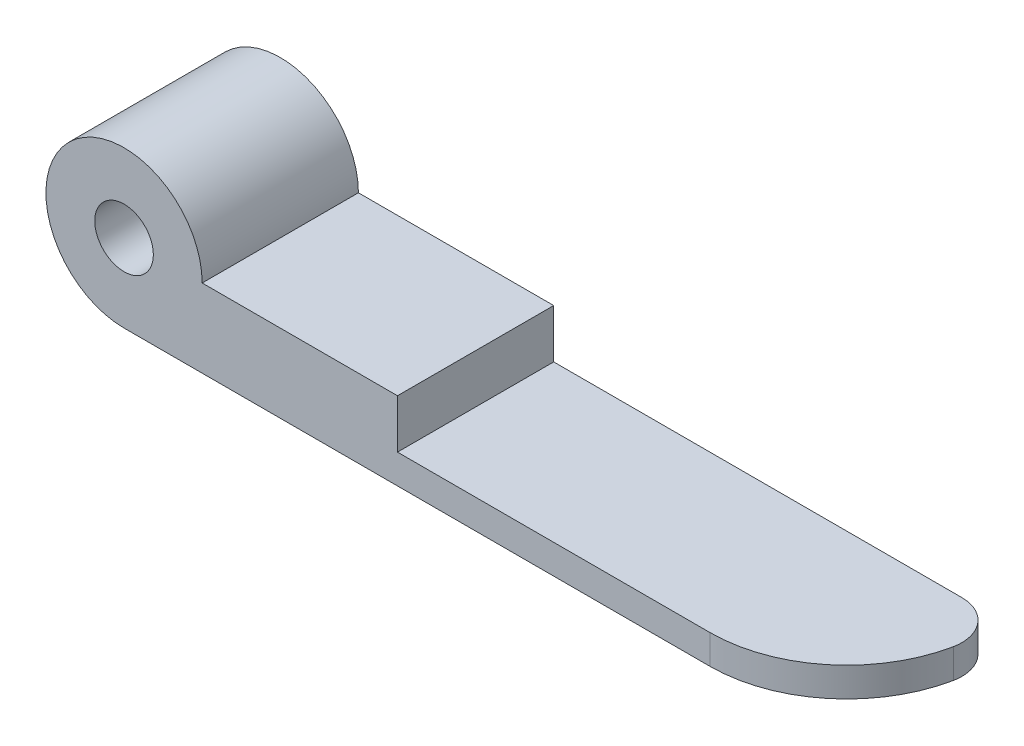
ISO-10303-21;
HEADER;
FILE_DESCRIPTION(('STEP AP214'),'2;1');
FILE_NAME('part.step','',(''),(''),'','','');
FILE_SCHEMA(('AUTOMOTIVE_DESIGN { 1 0 10303 214 1 1 1 1 }'));
ENDSEC;
DATA;
#1=APPLICATION_CONTEXT('core data for automotive mechanical design processes');
#2=APPLICATION_PROTOCOL_DEFINITION('international standard','automotive_design',2000,#1);
#3=PRODUCT_CONTEXT('',#1,'mechanical');
#4=PRODUCT('Part','Part','',(#3));
#5=PRODUCT_RELATED_PRODUCT_CATEGORY('part','',(#4));
#6=PRODUCT_DEFINITION_FORMATION('','',#4);
#7=PRODUCT_DEFINITION_CONTEXT('part definition',#1,'design');
#8=PRODUCT_DEFINITION('design','',#6,#7);
#9=PRODUCT_DEFINITION_SHAPE('','',#8);
#10=(LENGTH_UNIT() NAMED_UNIT(*) SI_UNIT(.MILLI.,.METRE.));
#11=(NAMED_UNIT(*) PLANE_ANGLE_UNIT() SI_UNIT($,.RADIAN.));
#12=(NAMED_UNIT(*) SI_UNIT($,.STERADIAN.) SOLID_ANGLE_UNIT());
#13=UNCERTAINTY_MEASURE_WITH_UNIT(LENGTH_MEASURE(1.E-05),#10,'distance_accuracy_value','');
#14=(GEOMETRIC_REPRESENTATION_CONTEXT(3) GLOBAL_UNCERTAINTY_ASSIGNED_CONTEXT((#13)) GLOBAL_UNIT_ASSIGNED_CONTEXT((#10,
#11,#12)) REPRESENTATION_CONTEXT('',''));
#15=CARTESIAN_POINT('',(0.,0.,0.));
#16=DIRECTION('',(0.,0.,1.));
#17=DIRECTION('',(1.,0.,0.));
#18=AXIS2_PLACEMENT_3D('',#15,#16,#17);
#19=CARTESIAN_POINT('',(0.,0.,8.));
#20=DIRECTION('',(0.,0.,-1.));
#21=DIRECTION('',(-1.,0.,0.));
#22=AXIS2_PLACEMENT_3D('',#19,#20,#21);
#23=CYLINDRICAL_SURFACE('',#22,4.);
#24=CARTESIAN_POINT('',(0.,0.,0.));
#25=DIRECTION('',(0.,0.,1.));
#26=DIRECTION('',(1.,0.,0.));
#27=AXIS2_PLACEMENT_3D('',#24,#25,#26);
#28=CIRCLE('',#27,4.);
#29=CARTESIAN_POINT('',(4.,0.,0.));
#30=VERTEX_POINT('',#29);
#31=CARTESIAN_POINT('',(0.,-4.,0.));
#32=VERTEX_POINT('',#31);
#33=EDGE_CURVE('E129',#30,#32,#28,.T.);
#34=ORIENTED_EDGE('',*,*,#33,.T.);
#35=DIRECTION('',(0.,0.,-1.));
#36=VECTOR('',#35,1.);
#37=CARTESIAN_POINT('',(0.,-4.,8.));
#38=LINE('',#37,#36);
#39=CARTESIAN_POINT('',(0.,-4.,8.));
#40=VERTEX_POINT('',#39);
#41=EDGE_CURVE('E137',#40,#32,#38,.T.);
#42=ORIENTED_EDGE('',*,*,#41,.F.);
#43=CARTESIAN_POINT('',(0.,0.,8.));
#44=DIRECTION('',(0.,0.,1.));
#45=DIRECTION('',(1.,0.,0.));
#46=AXIS2_PLACEMENT_3D('',#43,#44,#45);
#47=CIRCLE('',#46,4.);
#48=CARTESIAN_POINT('',(4.,0.,8.));
#49=VERTEX_POINT('',#48);
#50=EDGE_CURVE('E118',#49,#40,#47,.T.);
#51=ORIENTED_EDGE('',*,*,#50,.F.);
#52=DIRECTION('',(0.,0.,-1.));
#53=VECTOR('',#52,1.);
#54=CARTESIAN_POINT('',(4.,0.,8.));
#55=LINE('',#54,#53);
#56=EDGE_CURVE('E126',#49,#30,#55,.T.);
#57=ORIENTED_EDGE('',*,*,#56,.T.);
#58=EDGE_LOOP('',(#34,#42,#51,#57));
#59=FACE_BOUND('',#58,.T.);
#60=ADVANCED_FACE('F35',(#59),#23,.T.);
#61=CARTESIAN_POINT('',(0.,-4.,8.));
#62=DIRECTION('',(0.,1.,0.));
#63=DIRECTION('',(0.,0.,1.));
#64=AXIS2_PLACEMENT_3D('',#61,#62,#63);
#65=PLANE('',#64);
#66=DIRECTION('',(1.,0.,0.));
#67=VECTOR('',#66,1.);
#68=CARTESIAN_POINT('',(0.,-4.,0.));
#69=LINE('',#68,#67);
#70=CARTESIAN_POINT('',(34.8989794855664,-4.,0.));
#71=VERTEX_POINT('',#70);
#72=EDGE_CURVE('E132',#32,#71,#69,.T.);
#73=ORIENTED_EDGE('',*,*,#72,.T.);
#74=CARTESIAN_POINT('',(34.8989794855664,-4.,2.));
#75=DIRECTION('',(0.,1.,0.));
#76=DIRECTION('',(0.,0.,1.));
#77=AXIS2_PLACEMENT_3D('',#74,#75,#76);
#78=CIRCLE('',#77,2.);
#79=CARTESIAN_POINT('',(36.8585712797929,-4.,2.4));
#80=VERTEX_POINT('',#79);
#81=EDGE_CURVE('E11',#71,#80,#78,.F.);
#82=ORIENTED_EDGE('',*,*,#81,.T.);
#83=CARTESIAN_POINT('',(30.,-4.,1.));
#84=DIRECTION('',(0.,1.,0.));
#85=DIRECTION('',(0.,0.,1.));
#86=AXIS2_PLACEMENT_3D('',#83,#84,#85);
#87=CIRCLE('',#86,7.);
#88=CARTESIAN_POINT('',(30.,-4.,8.));
#89=VERTEX_POINT('',#88);
#90=EDGE_CURVE('E145',#80,#89,#87,.F.);
#91=ORIENTED_EDGE('',*,*,#90,.T.);
#92=DIRECTION('',(1.,0.,0.));
#93=VECTOR('',#92,1.);
#94=CARTESIAN_POINT('',(0.,-4.,8.));
#95=LINE('',#94,#93);
#96=EDGE_CURVE('E121',#40,#89,#95,.T.);
#97=ORIENTED_EDGE('',*,*,#96,.F.);
#98=ORIENTED_EDGE('',*,*,#41,.T.);
#99=EDGE_LOOP('',(#73,#82,#91,#97,#98));
#100=FACE_BOUND('',#99,.T.);
#101=ADVANCED_FACE('F170',(#100),#65,.F.);
#102=CARTESIAN_POINT('',(0.,0.,8.));
#103=DIRECTION('',(0.,0.,-1.));
#104=DIRECTION('',(-1.,0.,0.));
#105=AXIS2_PLACEMENT_3D('',#102,#103,#104);
#106=CYLINDRICAL_SURFACE('',#105,1.5);
#107=CARTESIAN_POINT('',(0.,0.,8.));
#108=DIRECTION('',(0.,0.,1.));
#109=DIRECTION('',(1.,0.,0.));
#110=AXIS2_PLACEMENT_3D('',#107,#108,#109);
#111=CIRCLE('',#110,1.5);
#112=CARTESIAN_POINT('',(1.5,0.,8.));
#113=VERTEX_POINT('',#112);
#114=EDGE_CURVE('E115',#113,#113,#111,.T.);
#115=ORIENTED_EDGE('',*,*,#114,.T.);
#116=EDGE_LOOP('',(#115));
#117=FACE_BOUND('',#116,.T.);
#118=CARTESIAN_POINT('',(0.,0.,0.));
#119=DIRECTION('',(0.,0.,1.));
#120=DIRECTION('',(1.,0.,0.));
#121=AXIS2_PLACEMENT_3D('',#118,#119,#120);
#122=CIRCLE('',#121,1.5);
#123=CARTESIAN_POINT('',(1.5,0.,0.));
#124=VERTEX_POINT('',#123);
#125=EDGE_CURVE('E111',#124,#124,#122,.T.);
#126=ORIENTED_EDGE('',*,*,#125,.F.);
#127=EDGE_LOOP('',(#126));
#128=FACE_BOUND('',#127,.T.);
#129=ADVANCED_FACE('F180',(#117,#128),#106,.F.);
#130=CARTESIAN_POINT('',(0.,0.,8.));
#131=DIRECTION('',(0.,-1.,0.));
#132=DIRECTION('',(1.,0.,0.));
#133=AXIS2_PLACEMENT_3D('',#130,#131,#132);
#134=PLANE('',#133);
#135=DIRECTION('',(-1.,0.,0.));
#136=VECTOR('',#135,1.);
#137=CARTESIAN_POINT('',(0.,0.,8.));
#138=LINE('',#137,#136);
#139=CARTESIAN_POINT('',(14.,0.,8.));
#140=VERTEX_POINT('',#139);
#141=EDGE_CURVE('E124',#140,#49,#138,.T.);
#142=ORIENTED_EDGE('',*,*,#141,.F.);
#143=DIRECTION('',(0.,0.,1.));
#144=VECTOR('',#143,1.);
#145=CARTESIAN_POINT('',(14.,0.,0.));
#146=LINE('',#145,#144);
#147=CARTESIAN_POINT('',(14.,0.,0.));
#148=VERTEX_POINT('',#147);
#149=EDGE_CURVE('E158',#148,#140,#146,.T.);
#150=ORIENTED_EDGE('',*,*,#149,.F.);
#151=DIRECTION('',(-1.,0.,0.));
#152=VECTOR('',#151,1.);
#153=CARTESIAN_POINT('',(0.,0.,0.));
#154=LINE('',#153,#152);
#155=EDGE_CURVE('E109',#148,#30,#154,.T.);
#156=ORIENTED_EDGE('',*,*,#155,.T.);
#157=ORIENTED_EDGE('',*,*,#56,.F.);
#158=EDGE_LOOP('',(#142,#150,#156,#157));
#159=FACE_BOUND('',#158,.T.);
#160=ADVANCED_FACE('F165',(#159),#134,.F.);
#161=CARTESIAN_POINT('',(0.,0.,8.));
#162=DIRECTION('',(0.,0.,1.));
#163=DIRECTION('',(1.,0.,0.));
#164=AXIS2_PLACEMENT_3D('',#161,#162,#163);
#165=PLANE('',#164);
#166=ORIENTED_EDGE('',*,*,#96,.T.);
#167=DIRECTION('',(0.,1.,0.));
#168=VECTOR('',#167,1.);
#169=CARTESIAN_POINT('',(30.,-2.5,8.));
#170=LINE('',#169,#168);
#171=CARTESIAN_POINT('',(30.,-2.5,8.));
#172=VERTEX_POINT('',#171);
#173=EDGE_CURVE('E140',#89,#172,#170,.T.);
#174=ORIENTED_EDGE('',*,*,#173,.T.);
#175=DIRECTION('',(1.,0.,0.));
#176=VECTOR('',#175,1.);
#177=CARTESIAN_POINT('',(14.,-2.5,8.));
#178=LINE('',#177,#176);
#179=CARTESIAN_POINT('',(14.,-2.5,8.));
#180=VERTEX_POINT('',#179);
#181=EDGE_CURVE('E97',#180,#172,#178,.T.);
#182=ORIENTED_EDGE('',*,*,#181,.F.);
#183=DIRECTION('',(0.,1.,0.));
#184=VECTOR('',#183,1.);
#185=CARTESIAN_POINT('',(14.,-2.5,8.));
#186=LINE('',#185,#184);
#187=EDGE_CURVE('E104',#180,#140,#186,.T.);
#188=ORIENTED_EDGE('',*,*,#187,.T.);
#189=ORIENTED_EDGE('',*,*,#141,.T.);
#190=ORIENTED_EDGE('',*,*,#50,.T.);
#191=EDGE_LOOP('',(#166,#174,#182,#188,#189,#190));
#192=FACE_BOUND('',#191,.T.);
#193=ORIENTED_EDGE('',*,*,#114,.F.);
#194=EDGE_LOOP('',(#193));
#195=FACE_BOUND('',#194,.T.);
#196=ADVANCED_FACE('F162',(#192,#195),#165,.T.);
#197=CARTESIAN_POINT('',(0.,0.,0.));
#198=DIRECTION('',(0.,0.,1.));
#199=DIRECTION('',(1.,0.,0.));
#200=AXIS2_PLACEMENT_3D('',#197,#198,#199);
#201=PLANE('',#200);
#202=ORIENTED_EDGE('',*,*,#125,.T.);
#203=EDGE_LOOP('',(#202));
#204=FACE_BOUND('',#203,.T.);
#205=DIRECTION('',(-1.,0.,0.));
#206=VECTOR('',#205,1.);
#207=CARTESIAN_POINT('',(37.,-2.5,0.));
#208=LINE('',#207,#206);
#209=CARTESIAN_POINT('',(34.8989794855664,-2.5,0.));
#210=VERTEX_POINT('',#209);
#211=CARTESIAN_POINT('',(14.,-2.5,0.));
#212=VERTEX_POINT('',#211);
#213=EDGE_CURVE('E90',#210,#212,#208,.T.);
#214=ORIENTED_EDGE('',*,*,#213,.F.);
#215=DIRECTION('',(0.,1.,0.));
#216=VECTOR('',#215,1.);
#217=CARTESIAN_POINT('',(34.8989794855664,-4.,0.));
#218=LINE('',#217,#216);
#219=EDGE_CURVE('E43',#210,#71,#218,.F.);
#220=ORIENTED_EDGE('',*,*,#219,.T.);
#221=ORIENTED_EDGE('',*,*,#72,.F.);
#222=ORIENTED_EDGE('',*,*,#33,.F.);
#223=ORIENTED_EDGE('',*,*,#155,.F.);
#224=DIRECTION('',(0.,1.,0.));
#225=VECTOR('',#224,1.);
#226=CARTESIAN_POINT('',(14.,-2.5,0.));
#227=LINE('',#226,#225);
#228=EDGE_CURVE('E101',#212,#148,#227,.T.);
#229=ORIENTED_EDGE('',*,*,#228,.F.);
#230=EDGE_LOOP('',(#214,#220,#221,#222,#223,#229));
#231=FACE_BOUND('',#230,.T.);
#232=ADVANCED_FACE('F107',(#204,#231),#201,.F.);
#233=CARTESIAN_POINT('',(14.,-2.5,0.));
#234=DIRECTION('',(-1.,0.,0.));
#235=DIRECTION('',(0.,-1.,0.));
#236=AXIS2_PLACEMENT_3D('',#233,#234,#235);
#237=PLANE('',#236);
#238=ORIENTED_EDGE('',*,*,#149,.T.);
#239=ORIENTED_EDGE('',*,*,#187,.F.);
#240=DIRECTION('',(0.,0.,1.));
#241=VECTOR('',#240,1.);
#242=CARTESIAN_POINT('',(14.,-2.5,0.));
#243=LINE('',#242,#241);
#244=EDGE_CURVE('E94',#212,#180,#243,.T.);
#245=ORIENTED_EDGE('',*,*,#244,.F.);
#246=ORIENTED_EDGE('',*,*,#228,.T.);
#247=EDGE_LOOP('',(#238,#239,#245,#246));
#248=FACE_BOUND('',#247,.T.);
#249=ADVANCED_FACE('F100',(#248),#237,.F.);
#250=CARTESIAN_POINT('',(0.,-2.5,0.));
#251=DIRECTION('',(0.,1.,0.));
#252=DIRECTION('',(-1.,0.,0.));
#253=AXIS2_PLACEMENT_3D('',#250,#251,#252);
#254=PLANE('',#253);
#255=CARTESIAN_POINT('',(30.,-2.5,1.));
#256=DIRECTION('',(0.,1.,0.));
#257=DIRECTION('',(-1.,0.,0.));
#258=AXIS2_PLACEMENT_3D('',#255,#256,#257);
#259=CIRCLE('',#258,7.);
#260=CARTESIAN_POINT('',(36.8585712797929,-2.5,2.4));
#261=VERTEX_POINT('',#260);
#262=EDGE_CURVE('E143',#172,#261,#259,.T.);
#263=ORIENTED_EDGE('',*,*,#262,.T.);
#264=CARTESIAN_POINT('',(34.8989794855664,-2.5,2.));
#265=DIRECTION('',(0.,1.,0.));
#266=DIRECTION('',(-1.,0.,0.));
#267=AXIS2_PLACEMENT_3D('',#264,#265,#266);
#268=CIRCLE('',#267,2.);
#269=EDGE_CURVE('E57',#261,#210,#268,.T.);
#270=ORIENTED_EDGE('',*,*,#269,.T.);
#271=ORIENTED_EDGE('',*,*,#213,.T.);
#272=ORIENTED_EDGE('',*,*,#244,.T.);
#273=ORIENTED_EDGE('',*,*,#181,.T.);
#274=EDGE_LOOP('',(#263,#270,#271,#272,#273));
#275=FACE_BOUND('',#274,.T.);
#276=ADVANCED_FACE('F92',(#275),#254,.T.);
#277=CARTESIAN_POINT('',(30.,0.,1.));
#278=DIRECTION('',(0.,-1.,0.));
#279=DIRECTION('',(0.,0.,-1.));
#280=AXIS2_PLACEMENT_3D('',#277,#278,#279);
#281=CYLINDRICAL_SURFACE('',#280,7.);
#282=ORIENTED_EDGE('',*,*,#90,.F.);
#283=DIRECTION('',(0.,-1.,0.));
#284=VECTOR('',#283,1.);
#285=CARTESIAN_POINT('',(36.8585712797929,0.,2.4));
#286=LINE('',#285,#284);
#287=EDGE_CURVE('E147',#80,#261,#286,.F.);
#288=ORIENTED_EDGE('',*,*,#287,.T.);
#289=ORIENTED_EDGE('',*,*,#262,.F.);
#290=ORIENTED_EDGE('',*,*,#173,.F.);
#291=EDGE_LOOP('',(#282,#288,#289,#290));
#292=FACE_BOUND('',#291,.T.);
#293=ADVANCED_FACE('F153',(#292),#281,.T.);
#294=CARTESIAN_POINT('',(34.8989794855664,0.,2.));
#295=DIRECTION('',(0.,-1.,0.));
#296=DIRECTION('',(0.,0.,-1.));
#297=AXIS2_PLACEMENT_3D('',#294,#295,#296);
#298=CYLINDRICAL_SURFACE('',#297,2.);
#299=ORIENTED_EDGE('',*,*,#81,.F.);
#300=ORIENTED_EDGE('',*,*,#219,.F.);
#301=ORIENTED_EDGE('',*,*,#269,.F.);
#302=ORIENTED_EDGE('',*,*,#287,.F.);
#303=EDGE_LOOP('',(#299,#300,#301,#302));
#304=FACE_BOUND('',#303,.T.);
#305=ADVANCED_FACE('F37',(#304),#298,.T.);
#306=CLOSED_SHELL('',(#60,#101,#129,#160,#196,#232,#249,#276,#293,#305));
#307=MANIFOLD_SOLID_BREP('B2',#306);
#308=ADVANCED_BREP_SHAPE_REPRESENTATION('',(#18,#307),#14);
#309=SHAPE_DEFINITION_REPRESENTATION(#9,#308);
ENDSEC;
END-ISO-10303-21;
